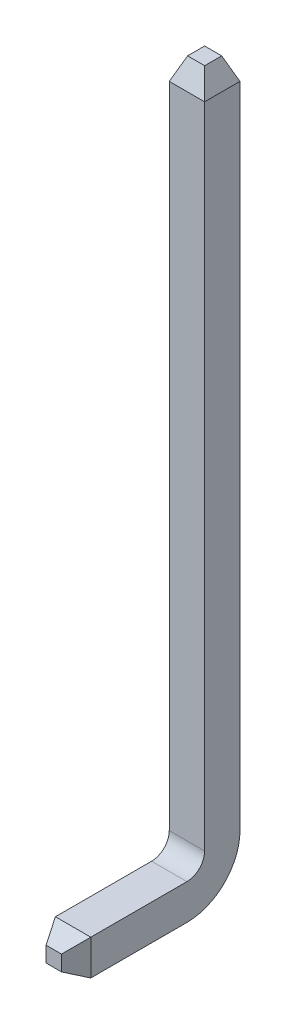
ISO-10303-21;
HEADER;
FILE_DESCRIPTION(('STEP AP214'),'2;1');
FILE_NAME('part.step','',(''),(''),'','','');
FILE_SCHEMA(('AUTOMOTIVE_DESIGN { 1 0 10303 214 1 1 1 1 }'));
ENDSEC;
DATA;
#1=APPLICATION_CONTEXT('core data for automotive mechanical design processes');
#2=APPLICATION_PROTOCOL_DEFINITION('international standard','automotive_design',2000,#1);
#3=PRODUCT_CONTEXT('',#1,'mechanical');
#4=PRODUCT('Part','Part','',(#3));
#5=PRODUCT_RELATED_PRODUCT_CATEGORY('part','',(#4));
#6=PRODUCT_DEFINITION_FORMATION('','',#4);
#7=PRODUCT_DEFINITION_CONTEXT('part definition',#1,'design');
#8=PRODUCT_DEFINITION('design','',#6,#7);
#9=PRODUCT_DEFINITION_SHAPE('','',#8);
#10=(LENGTH_UNIT() NAMED_UNIT(*) SI_UNIT(.MILLI.,.METRE.));
#11=(NAMED_UNIT(*) PLANE_ANGLE_UNIT() SI_UNIT($,.RADIAN.));
#12=(NAMED_UNIT(*) SI_UNIT($,.STERADIAN.) SOLID_ANGLE_UNIT());
#13=UNCERTAINTY_MEASURE_WITH_UNIT(LENGTH_MEASURE(1.E-05),#10,'distance_accuracy_value','');
#14=(GEOMETRIC_REPRESENTATION_CONTEXT(3) GLOBAL_UNCERTAINTY_ASSIGNED_CONTEXT((#13)) GLOBAL_UNIT_ASSIGNED_CONTEXT((#10,
#11,#12)) REPRESENTATION_CONTEXT('',''));
#15=CARTESIAN_POINT('',(0.,0.,0.));
#16=DIRECTION('',(0.,0.,1.));
#17=DIRECTION('',(1.,0.,0.));
#18=AXIS2_PLACEMENT_3D('',#15,#16,#17);
#19=CARTESIAN_POINT('',(0.164314575050762,9.85,-8.42));
#20=DIRECTION('',(0.923879532511288,0.382683432365087,0.));
#21=DIRECTION('',(-0.382683432365087,0.923879532511288,0.));
#22=AXIS2_PLACEMENT_3D('',#19,#20,#21);
#23=PLANE('',#22);
#24=DIRECTION('',(0.357406744336591,-0.862856209461019,-0.357406744336591));
#25=VECTOR('',#24,1.);
#26=CARTESIAN_POINT('',(0.164314575050762,9.85,1.10568542494924));
#27=LINE('',#26,#25);
#28=CARTESIAN_POINT('',(0.164314575050762,9.85,1.10568542494924));
#29=VERTEX_POINT('',#28);
#30=CARTESIAN_POINT('',(0.33,9.45,0.94));
#31=VERTEX_POINT('',#30);
#32=EDGE_CURVE('E110',#29,#31,#27,.T.);
#33=ORIENTED_EDGE('',*,*,#32,.F.);
#34=DIRECTION('',(0.,0.,-1.));
#35=VECTOR('',#34,1.);
#36=CARTESIAN_POINT('',(0.164314575050762,9.85,-8.42));
#37=LINE('',#36,#35);
#38=CARTESIAN_POINT('',(0.164314575050762,9.85,1.41431457505076));
#39=VERTEX_POINT('',#38);
#40=EDGE_CURVE('E105',#29,#39,#37,.F.);
#41=ORIENTED_EDGE('',*,*,#40,.T.);
#42=DIRECTION('',(-0.357406744336591,0.862856209461019,-0.357406744336591));
#43=VECTOR('',#42,1.);
#44=CARTESIAN_POINT('',(0.33,9.45,1.58));
#45=LINE('',#44,#43);
#46=CARTESIAN_POINT('',(0.33,9.45,1.58));
#47=VERTEX_POINT('',#46);
#48=EDGE_CURVE('E107',#47,#39,#45,.T.);
#49=ORIENTED_EDGE('',*,*,#48,.F.);
#50=DIRECTION('',(0.,0.,-1.));
#51=VECTOR('',#50,1.);
#52=CARTESIAN_POINT('',(0.33,9.45,3.64));
#53=LINE('',#52,#51);
#54=EDGE_CURVE('E226',#31,#47,#53,.F.);
#55=ORIENTED_EDGE('',*,*,#54,.F.);
#56=EDGE_LOOP('',(#33,#41,#49,#55));
#57=FACE_BOUND('',#56,.T.);
#58=ADVANCED_FACE('F17',(#57),#23,.T.);
#59=CARTESIAN_POINT('',(0.15,-3.25,3.99));
#60=DIRECTION('',(0.889287802318019,0.,0.45734801262101));
#61=DIRECTION('',(0.45734801262101,0.,-0.889287802318019));
#62=AXIS2_PLACEMENT_3D('',#59,#60,#61);
#63=PLANE('',#62);
#64=DIRECTION('',(-0.415914073839761,0.415914073839919,0.808721810243731));
#65=VECTOR('',#64,1.);
#66=CARTESIAN_POINT('',(0.330000000000024,-3.25000000000009,3.64000000000006));
#67=LINE('',#66,#65);
#68=CARTESIAN_POINT('',(0.330000000000005,-3.25000000000002,3.64000000000003));
#69=VERTEX_POINT('',#68);
#70=CARTESIAN_POINT('',(0.15,-3.07,3.99));
#71=VERTEX_POINT('',#70);
#72=EDGE_CURVE('E139',#69,#71,#67,.T.);
#73=ORIENTED_EDGE('',*,*,#72,.F.);
#74=DIRECTION('',(0.,1.,0.));
#75=VECTOR('',#74,1.);
#76=CARTESIAN_POINT('',(0.33,-3.4065,3.64000000000001));
#77=LINE('',#76,#75);
#78=CARTESIAN_POINT('',(0.330000000000018,-2.60999999999998,3.64000000000002));
#79=VERTEX_POINT('',#78);
#80=EDGE_CURVE('E76',#79,#69,#77,.F.);
#81=ORIENTED_EDGE('',*,*,#80,.F.);
#82=DIRECTION('',(0.415914073839761,0.415914073839919,-0.80872181024373));
#83=VECTOR('',#82,1.);
#84=CARTESIAN_POINT('',(0.15,-2.79,3.99));
#85=LINE('',#84,#83);
#86=CARTESIAN_POINT('',(0.15,-2.79,3.99));
#87=VERTEX_POINT('',#86);
#88=EDGE_CURVE('E147',#87,#79,#85,.T.);
#89=ORIENTED_EDGE('',*,*,#88,.F.);
#90=DIRECTION('',(0.,1.,0.));
#91=VECTOR('',#90,1.);
#92=CARTESIAN_POINT('',(0.15,-3.07,3.99));
#93=LINE('',#92,#91);
#94=EDGE_CURVE('E144',#71,#87,#93,.T.);
#95=ORIENTED_EDGE('',*,*,#94,.F.);
#96=EDGE_LOOP('',(#73,#81,#89,#95));
#97=FACE_BOUND('',#96,.T.);
#98=ADVANCED_FACE('F369',(#97),#63,.T.);
#99=CARTESIAN_POINT('',(-0.501658940511742,9.85,1.41431457505076));
#100=DIRECTION('',(0.,0.382683432365087,0.923879532511288));
#101=DIRECTION('',(0.,-0.923879532511288,0.382683432365087));
#102=AXIS2_PLACEMENT_3D('',#99,#100,#101);
#103=PLANE('',#102);
#104=DIRECTION('',(0.357406744336591,0.862856209461019,-0.357406744336591));
#105=VECTOR('',#104,1.);
#106=CARTESIAN_POINT('',(-0.31,9.45,1.58));
#107=LINE('',#106,#105);
#108=CARTESIAN_POINT('',(-0.31,9.45,1.58));
#109=VERTEX_POINT('',#108);
#110=CARTESIAN_POINT('',(-0.144314575050762,9.85,1.41431457505076));
#111=VERTEX_POINT('',#110);
#112=EDGE_CURVE('E189',#109,#111,#107,.T.);
#113=ORIENTED_EDGE('',*,*,#112,.F.);
#114=DIRECTION('',(1.,0.,0.));
#115=VECTOR('',#114,1.);
#116=CARTESIAN_POINT('',(-0.31,9.45,1.58));
#117=LINE('',#116,#115);
#118=EDGE_CURVE('E122',#47,#109,#117,.F.);
#119=ORIENTED_EDGE('',*,*,#118,.F.);
#120=ORIENTED_EDGE('',*,*,#48,.T.);
#121=DIRECTION('',(1.,0.,0.));
#122=VECTOR('',#121,1.);
#123=CARTESIAN_POINT('',(-0.501658940511742,9.85,1.41431457505076));
#124=LINE('',#123,#122);
#125=EDGE_CURVE('E114',#39,#111,#124,.F.);
#126=ORIENTED_EDGE('',*,*,#125,.T.);
#127=EDGE_LOOP('',(#113,#119,#120,#126));
#128=FACE_BOUND('',#127,.T.);
#129=ADVANCED_FACE('F119',(#128),#103,.T.);
#130=CARTESIAN_POINT('',(-0.501658940511742,9.85,-8.42));
#131=DIRECTION('',(0.,-1.,0.));
#132=DIRECTION('',(0.,0.,-1.));
#133=AXIS2_PLACEMENT_3D('',#130,#131,#132);
#134=PLANE('',#133);
#135=DIRECTION('',(0.,0.,1.));
#136=VECTOR('',#135,1.);
#137=CARTESIAN_POINT('',(-0.144314575050762,9.85,-8.42));
#138=LINE('',#137,#136);
#139=CARTESIAN_POINT('',(-0.144314575050762,9.85,1.10568542494924));
#140=VERTEX_POINT('',#139);
#141=EDGE_CURVE('E127',#111,#140,#138,.F.);
#142=ORIENTED_EDGE('',*,*,#141,.F.);
#143=ORIENTED_EDGE('',*,*,#125,.F.);
#144=ORIENTED_EDGE('',*,*,#40,.F.);
#145=DIRECTION('',(1.,0.,0.));
#146=VECTOR('',#145,1.);
#147=CARTESIAN_POINT('',(-0.501658940511742,9.85,1.10568542494924));
#148=LINE('',#147,#146);
#149=EDGE_CURVE('E130',#140,#29,#148,.T.);
#150=ORIENTED_EDGE('',*,*,#149,.F.);
#151=EDGE_LOOP('',(#142,#143,#144,#150));
#152=FACE_BOUND('',#151,.T.);
#153=ADVANCED_FACE('F125',(#152),#134,.F.);
#154=CARTESIAN_POINT('',(-0.501658940511742,9.85,1.10568542494924));
#155=DIRECTION('',(0.,0.382683432365087,-0.923879532511288));
#156=DIRECTION('',(0.,0.923879532511288,0.382683432365087));
#157=AXIS2_PLACEMENT_3D('',#154,#155,#156);
#158=PLANE('',#157);
#159=DIRECTION('',(-0.357406744336591,-0.862856209461019,-0.357406744336591));
#160=VECTOR('',#159,1.);
#161=CARTESIAN_POINT('',(-0.144314575050762,9.85,1.10568542494924));
#162=LINE('',#161,#160);
#163=CARTESIAN_POINT('',(-0.31,9.45,0.94));
#164=VERTEX_POINT('',#163);
#165=EDGE_CURVE('E186',#140,#164,#162,.T.);
#166=ORIENTED_EDGE('',*,*,#165,.F.);
#167=ORIENTED_EDGE('',*,*,#149,.T.);
#168=ORIENTED_EDGE('',*,*,#32,.T.);
#169=DIRECTION('',(-1.,0.,0.));
#170=VECTOR('',#169,1.);
#171=CARTESIAN_POINT('',(0.33,9.45,0.94));
#172=LINE('',#171,#170);
#173=EDGE_CURVE('E170',#164,#31,#172,.F.);
#174=ORIENTED_EDGE('',*,*,#173,.F.);
#175=EDGE_LOOP('',(#166,#167,#168,#174));
#176=FACE_BOUND('',#175,.T.);
#177=ADVANCED_FACE('F259',(#176),#158,.T.);
#178=CARTESIAN_POINT('',(-0.31,-3.07,3.99));
#179=DIRECTION('',(0.,-0.889287802318019,0.45734801262101));
#180=DIRECTION('',(0.,-0.45734801262101,-0.889287802318019));
#181=AXIS2_PLACEMENT_3D('',#178,#179,#180);
#182=PLANE('',#181);
#183=DIRECTION('',(0.415914073839919,0.415914073839762,0.80872181024373));
#184=VECTOR('',#183,1.);
#185=CARTESIAN_POINT('',(-0.310000000000093,-3.25000000000002,3.64000000000006));
#186=LINE('',#185,#184);
#187=CARTESIAN_POINT('',(-0.310000000000022,-3.25000000000001,3.64000000000003));
#188=VERTEX_POINT('',#187);
#189=CARTESIAN_POINT('',(-0.13,-3.07,3.99));
#190=VERTEX_POINT('',#189);
#191=EDGE_CURVE('E217',#188,#190,#186,.T.);
#192=ORIENTED_EDGE('',*,*,#191,.F.);
#193=DIRECTION('',(1.,0.,0.));
#194=VECTOR('',#193,1.);
#195=CARTESIAN_POINT('',(-0.31,-3.25,3.64000000000001));
#196=LINE('',#195,#194);
#197=EDGE_CURVE('E234',#69,#188,#196,.F.);
#198=ORIENTED_EDGE('',*,*,#197,.F.);
#199=ORIENTED_EDGE('',*,*,#72,.T.);
#200=DIRECTION('',(1.,0.,0.));
#201=VECTOR('',#200,1.);
#202=CARTESIAN_POINT('',(-0.13,-3.07,3.99));
#203=LINE('',#202,#201);
#204=EDGE_CURVE('E148',#190,#71,#203,.T.);
#205=ORIENTED_EDGE('',*,*,#204,.F.);
#206=EDGE_LOOP('',(#192,#198,#199,#205));
#207=FACE_BOUND('',#206,.T.);
#208=ADVANCED_FACE('F360',(#207),#182,.T.);
#209=CARTESIAN_POINT('',(-0.13,-3.07,3.99));
#210=DIRECTION('',(0.,0.,1.));
#211=DIRECTION('',(1.,0.,0.));
#212=AXIS2_PLACEMENT_3D('',#209,#210,#211);
#213=PLANE('',#212);
#214=ORIENTED_EDGE('',*,*,#204,.T.);
#215=ORIENTED_EDGE('',*,*,#94,.T.);
#216=DIRECTION('',(1.,0.,0.));
#217=VECTOR('',#216,1.);
#218=CARTESIAN_POINT('',(0.33,-2.79,3.99));
#219=LINE('',#218,#217);
#220=CARTESIAN_POINT('',(-0.13,-2.79,3.99));
#221=VERTEX_POINT('',#220);
#222=EDGE_CURVE('E211',#221,#87,#219,.T.);
#223=ORIENTED_EDGE('',*,*,#222,.F.);
#224=DIRECTION('',(0.,1.,0.));
#225=VECTOR('',#224,1.);
#226=CARTESIAN_POINT('',(-0.13,-2.61,3.99));
#227=LINE('',#226,#225);
#228=EDGE_CURVE('E214',#190,#221,#227,.T.);
#229=ORIENTED_EDGE('',*,*,#228,.F.);
#230=EDGE_LOOP('',(#214,#215,#223,#229));
#231=FACE_BOUND('',#230,.T.);
#232=ADVANCED_FACE('F357',(#231),#213,.T.);
#233=CARTESIAN_POINT('',(0.33,-2.79,3.99));
#234=DIRECTION('',(0.,0.889287802318019,0.45734801262101));
#235=DIRECTION('',(0.,-0.45734801262101,0.889287802318019));
#236=AXIS2_PLACEMENT_3D('',#233,#234,#235);
#237=PLANE('',#236);
#238=DIRECTION('',(-0.415914073839919,0.415914073839761,-0.808721810243731));
#239=VECTOR('',#238,1.);
#240=CARTESIAN_POINT('',(-0.13,-2.79,3.99));
#241=LINE('',#240,#239);
#242=CARTESIAN_POINT('',(-0.310000000000023,-2.60999999999998,3.64000000000002));
#243=VERTEX_POINT('',#242);
#244=EDGE_CURVE('E285',#221,#243,#241,.T.);
#245=ORIENTED_EDGE('',*,*,#244,.F.);
#246=ORIENTED_EDGE('',*,*,#222,.T.);
#247=ORIENTED_EDGE('',*,*,#88,.T.);
#248=DIRECTION('',(1.,0.,0.));
#249=VECTOR('',#248,1.);
#250=CARTESIAN_POINT('',(0.33,-2.61,3.64000000000001));
#251=LINE('',#250,#249);
#252=EDGE_CURVE('E204',#243,#79,#251,.T.);
#253=ORIENTED_EDGE('',*,*,#252,.F.);
#254=EDGE_LOOP('',(#245,#246,#247,#253));
#255=FACE_BOUND('',#254,.T.);
#256=ADVANCED_FACE('F314',(#255),#237,.T.);
#257=CARTESIAN_POINT('',(0.33,-3.4065,3.64));
#258=DIRECTION('',(1.,0.,0.));
#259=DIRECTION('',(0.,0.,-1.));
#260=AXIS2_PLACEMENT_3D('',#257,#258,#259);
#261=PLANE('',#260);
#262=DIRECTION('',(0.,0.,-1.));
#263=VECTOR('',#262,1.);
#264=CARTESIAN_POINT('',(0.33,-3.25,1.9));
#265=LINE('',#264,#263);
#266=CARTESIAN_POINT('',(0.33,-3.25,1.9));
#267=VERTEX_POINT('',#266);
#268=EDGE_CURVE('E165',#267,#69,#265,.F.);
#269=ORIENTED_EDGE('',*,*,#268,.F.);
#270=CARTESIAN_POINT('',(0.33,-2.29,1.9));
#271=DIRECTION('',(1.,0.,0.));
#272=DIRECTION('',(0.,0.,-1.));
#273=AXIS2_PLACEMENT_3D('',#270,#271,#272);
#274=CIRCLE('',#273,0.96);
#275=CARTESIAN_POINT('',(0.33,-2.29,0.94));
#276=VERTEX_POINT('',#275);
#277=EDGE_CURVE('E157',#276,#267,#274,.F.);
#278=ORIENTED_EDGE('',*,*,#277,.F.);
#279=DIRECTION('',(0.,1.,0.));
#280=VECTOR('',#279,1.);
#281=CARTESIAN_POINT('',(0.33,-2.29,0.94));
#282=LINE('',#281,#280);
#283=EDGE_CURVE('E167',#31,#276,#282,.F.);
#284=ORIENTED_EDGE('',*,*,#283,.F.);
#285=ORIENTED_EDGE('',*,*,#54,.T.);
#286=DIRECTION('',(0.,1.,0.));
#287=VECTOR('',#286,1.);
#288=CARTESIAN_POINT('',(0.33,-2.29,1.58));
#289=LINE('',#288,#287);
#290=CARTESIAN_POINT('',(0.33,-2.29,1.58));
#291=VERTEX_POINT('',#290);
#292=EDGE_CURVE('E196',#291,#47,#289,.T.);
#293=ORIENTED_EDGE('',*,*,#292,.F.);
#294=CARTESIAN_POINT('',(0.33,-2.29,1.9));
#295=DIRECTION('',(-1.,0.,0.));
#296=DIRECTION('',(0.,0.,1.));
#297=AXIS2_PLACEMENT_3D('',#294,#295,#296);
#298=CIRCLE('',#297,0.32);
#299=CARTESIAN_POINT('',(0.330000000000012,-2.61,1.9));
#300=VERTEX_POINT('',#299);
#301=EDGE_CURVE('E20',#291,#300,#298,.T.);
#302=ORIENTED_EDGE('',*,*,#301,.T.);
#303=DIRECTION('',(0.,0.,1.));
#304=VECTOR('',#303,1.);
#305=CARTESIAN_POINT('',(0.330000000000024,-2.61,1.9));
#306=LINE('',#305,#304);
#307=EDGE_CURVE('E202',#79,#300,#306,.F.);
#308=ORIENTED_EDGE('',*,*,#307,.F.);
#309=ORIENTED_EDGE('',*,*,#80,.T.);
#310=EDGE_LOOP('',(#269,#278,#284,#285,#293,#302,#308,#309));
#311=FACE_BOUND('',#310,.T.);
#312=ADVANCED_FACE('F254',(#311),#261,.T.);
#313=CARTESIAN_POINT('',(-0.31,-2.29,1.58));
#314=DIRECTION('',(0.,0.,1.));
#315=DIRECTION('',(1.,0.,0.));
#316=AXIS2_PLACEMENT_3D('',#313,#314,#315);
#317=PLANE('',#316);
#318=DIRECTION('',(0.,1.,0.));
#319=VECTOR('',#318,1.);
#320=CARTESIAN_POINT('',(-0.31,-3.4065,1.58));
#321=LINE('',#320,#319);
#322=CARTESIAN_POINT('',(-0.31,-2.29,1.58));
#323=VERTEX_POINT('',#322);
#324=EDGE_CURVE('E183',#323,#109,#321,.T.);
#325=ORIENTED_EDGE('',*,*,#324,.F.);
#326=DIRECTION('',(-1.,0.,0.));
#327=VECTOR('',#326,1.);
#328=CARTESIAN_POINT('',(0.33,-2.29,1.58));
#329=LINE('',#328,#327);
#330=EDGE_CURVE('E252',#323,#291,#329,.F.);
#331=ORIENTED_EDGE('',*,*,#330,.T.);
#332=ORIENTED_EDGE('',*,*,#292,.T.);
#333=ORIENTED_EDGE('',*,*,#118,.T.);
#334=EDGE_LOOP('',(#325,#331,#332,#333));
#335=FACE_BOUND('',#334,.T.);
#336=ADVANCED_FACE('F250',(#335),#317,.T.);
#337=CARTESIAN_POINT('',(-0.144314575050762,9.85,-8.42));
#338=DIRECTION('',(-0.923879532511288,0.382683432365087,0.));
#339=DIRECTION('',(-0.382683432365087,-0.923879532511288,0.));
#340=AXIS2_PLACEMENT_3D('',#337,#338,#339);
#341=PLANE('',#340);
#342=ORIENTED_EDGE('',*,*,#112,.T.);
#343=ORIENTED_EDGE('',*,*,#141,.T.);
#344=ORIENTED_EDGE('',*,*,#165,.T.);
#345=DIRECTION('',(0.,0.,1.));
#346=VECTOR('',#345,1.);
#347=CARTESIAN_POINT('',(-0.31,9.45,0.913));
#348=LINE('',#347,#346);
#349=EDGE_CURVE('E180',#109,#164,#348,.F.);
#350=ORIENTED_EDGE('',*,*,#349,.F.);
#351=EDGE_LOOP('',(#342,#343,#344,#350));
#352=FACE_BOUND('',#351,.T.);
#353=ADVANCED_FACE('F244',(#352),#341,.T.);
#354=CARTESIAN_POINT('',(0.33,-2.29,0.94));
#355=DIRECTION('',(0.,0.,-1.));
#356=DIRECTION('',(-1.,0.,0.));
#357=AXIS2_PLACEMENT_3D('',#354,#355,#356);
#358=PLANE('',#357);
#359=ORIENTED_EDGE('',*,*,#283,.T.);
#360=DIRECTION('',(1.,0.,0.));
#361=VECTOR('',#360,1.);
#362=CARTESIAN_POINT('',(-0.31,-2.29,0.94));
#363=LINE('',#362,#361);
#364=CARTESIAN_POINT('',(-0.31,-2.29,0.94));
#365=VERTEX_POINT('',#364);
#366=EDGE_CURVE('E159',#365,#276,#363,.T.);
#367=ORIENTED_EDGE('',*,*,#366,.F.);
#368=DIRECTION('',(0.,1.,0.));
#369=VECTOR('',#368,1.);
#370=CARTESIAN_POINT('',(-0.31,-3.4065,0.94));
#371=LINE('',#370,#369);
#372=EDGE_CURVE('E156',#164,#365,#371,.F.);
#373=ORIENTED_EDGE('',*,*,#372,.F.);
#374=ORIENTED_EDGE('',*,*,#173,.T.);
#375=EDGE_LOOP('',(#359,#367,#373,#374));
#376=FACE_BOUND('',#375,.T.);
#377=ADVANCED_FACE('F262',(#376),#358,.T.);
#378=CARTESIAN_POINT('',(-0.31,-2.29,1.9));
#379=DIRECTION('',(1.,0.,0.));
#380=DIRECTION('',(0.,0.,-1.));
#381=AXIS2_PLACEMENT_3D('',#378,#379,#380);
#382=CYLINDRICAL_SURFACE('',#381,0.96);
#383=ORIENTED_EDGE('',*,*,#366,.T.);
#384=ORIENTED_EDGE('',*,*,#277,.T.);
#385=DIRECTION('',(1.,0.,0.));
#386=VECTOR('',#385,1.);
#387=CARTESIAN_POINT('',(-0.31,-3.25,1.9));
#388=LINE('',#387,#386);
#389=CARTESIAN_POINT('',(-0.31,-3.25,1.9));
#390=VERTEX_POINT('',#389);
#391=EDGE_CURVE('E158',#390,#267,#388,.T.);
#392=ORIENTED_EDGE('',*,*,#391,.F.);
#393=CARTESIAN_POINT('',(-0.31,-2.29,1.9));
#394=DIRECTION('',(1.,0.,0.));
#395=DIRECTION('',(0.,0.,-1.));
#396=AXIS2_PLACEMENT_3D('',#393,#394,#395);
#397=CIRCLE('',#396,0.96);
#398=EDGE_CURVE('E153',#365,#390,#397,.F.);
#399=ORIENTED_EDGE('',*,*,#398,.F.);
#400=EDGE_LOOP('',(#383,#384,#392,#399));
#401=FACE_BOUND('',#400,.T.);
#402=ADVANCED_FACE('F317',(#401),#382,.T.);
#403=CARTESIAN_POINT('',(-0.31,-3.25,1.9));
#404=DIRECTION('',(0.,-1.,0.));
#405=DIRECTION('',(0.,0.,-1.));
#406=AXIS2_PLACEMENT_3D('',#403,#404,#405);
#407=PLANE('',#406);
#408=ORIENTED_EDGE('',*,*,#197,.T.);
#409=DIRECTION('',(0.,0.,1.));
#410=VECTOR('',#409,1.);
#411=CARTESIAN_POINT('',(-0.31,-3.25,0.913));
#412=LINE('',#411,#410);
#413=EDGE_CURVE('E155',#390,#188,#412,.T.);
#414=ORIENTED_EDGE('',*,*,#413,.F.);
#415=ORIENTED_EDGE('',*,*,#391,.T.);
#416=ORIENTED_EDGE('',*,*,#268,.T.);
#417=EDGE_LOOP('',(#408,#414,#415,#416));
#418=FACE_BOUND('',#417,.T.);
#419=ADVANCED_FACE('F298',(#418),#407,.T.);
#420=CARTESIAN_POINT('',(-0.13,-2.61,3.99));
#421=DIRECTION('',(-0.889287802318019,0.,0.45734801262101));
#422=DIRECTION('',(0.45734801262101,0.,0.889287802318019));
#423=AXIS2_PLACEMENT_3D('',#420,#421,#422);
#424=PLANE('',#423);
#425=ORIENTED_EDGE('',*,*,#191,.T.);
#426=ORIENTED_EDGE('',*,*,#228,.T.);
#427=ORIENTED_EDGE('',*,*,#244,.T.);
#428=DIRECTION('',(0.,1.,0.));
#429=VECTOR('',#428,1.);
#430=CARTESIAN_POINT('',(-0.31,-3.4065,3.64000000000001));
#431=LINE('',#430,#429);
#432=EDGE_CURVE('E280',#188,#243,#431,.T.);
#433=ORIENTED_EDGE('',*,*,#432,.F.);
#434=EDGE_LOOP('',(#425,#426,#427,#433));
#435=FACE_BOUND('',#434,.T.);
#436=ADVANCED_FACE('F304',(#435),#424,.T.);
#437=CARTESIAN_POINT('',(0.33,-2.61,1.9));
#438=DIRECTION('',(0.,1.,0.));
#439=DIRECTION('',(0.,0.,1.));
#440=AXIS2_PLACEMENT_3D('',#437,#438,#439);
#441=PLANE('',#440);
#442=ORIENTED_EDGE('',*,*,#307,.T.);
#443=DIRECTION('',(-1.,0.,0.));
#444=VECTOR('',#443,1.);
#445=CARTESIAN_POINT('',(0.33,-2.61,1.9));
#446=LINE('',#445,#444);
#447=CARTESIAN_POINT('',(-0.31,-2.60999999999999,1.9));
#448=VERTEX_POINT('',#447);
#449=EDGE_CURVE('E35',#300,#448,#446,.T.);
#450=ORIENTED_EDGE('',*,*,#449,.T.);
#451=DIRECTION('',(0.,0.,1.));
#452=VECTOR('',#451,1.);
#453=CARTESIAN_POINT('',(-0.31,-2.60999999999998,0.913));
#454=LINE('',#453,#452);
#455=EDGE_CURVE('E26',#243,#448,#454,.F.);
#456=ORIENTED_EDGE('',*,*,#455,.F.);
#457=ORIENTED_EDGE('',*,*,#252,.T.);
#458=EDGE_LOOP('',(#442,#450,#456,#457));
#459=FACE_BOUND('',#458,.T.);
#460=ADVANCED_FACE('F312',(#459),#441,.T.);
#461=CARTESIAN_POINT('',(0.33,-2.29,1.9));
#462=DIRECTION('',(-1.,0.,0.));
#463=DIRECTION('',(0.,0.,1.));
#464=AXIS2_PLACEMENT_3D('',#461,#462,#463);
#465=CYLINDRICAL_SURFACE('',#464,0.32);
#466=CARTESIAN_POINT('',(-0.31,-2.29,1.9));
#467=DIRECTION('',(-1.,0.,0.));
#468=DIRECTION('',(0.,0.,1.));
#469=AXIS2_PLACEMENT_3D('',#466,#467,#468);
#470=CIRCLE('',#469,0.32);
#471=EDGE_CURVE('E11',#448,#323,#470,.F.);
#472=ORIENTED_EDGE('',*,*,#471,.F.);
#473=ORIENTED_EDGE('',*,*,#449,.F.);
#474=ORIENTED_EDGE('',*,*,#301,.F.);
#475=ORIENTED_EDGE('',*,*,#330,.F.);
#476=EDGE_LOOP('',(#472,#473,#474,#475));
#477=FACE_BOUND('',#476,.T.);
#478=ADVANCED_FACE('F328',(#477),#465,.F.);
#479=CARTESIAN_POINT('',(-0.31,-3.4065,0.913));
#480=DIRECTION('',(-1.,0.,0.));
#481=DIRECTION('',(0.,0.,1.));
#482=AXIS2_PLACEMENT_3D('',#479,#480,#481);
#483=PLANE('',#482);
#484=ORIENTED_EDGE('',*,*,#455,.T.);
#485=ORIENTED_EDGE('',*,*,#471,.T.);
#486=ORIENTED_EDGE('',*,*,#324,.T.);
#487=ORIENTED_EDGE('',*,*,#349,.T.);
#488=ORIENTED_EDGE('',*,*,#372,.T.);
#489=ORIENTED_EDGE('',*,*,#398,.T.);
#490=ORIENTED_EDGE('',*,*,#413,.T.);
#491=ORIENTED_EDGE('',*,*,#432,.T.);
#492=EDGE_LOOP('',(#484,#485,#486,#487,#488,#489,#490,#491));
#493=FACE_BOUND('',#492,.T.);
#494=ADVANCED_FACE('F267',(#493),#483,.T.);
#495=CLOSED_SHELL('',(#58,#98,#129,#153,#177,#208,#232,#256,#312,#336,#353,#377,#402,#419,#436,
#460,#478,#494));
#496=MANIFOLD_SOLID_BREP('B1',#495);
#497=ADVANCED_BREP_SHAPE_REPRESENTATION('',(#18,#496),#14);
#498=SHAPE_DEFINITION_REPRESENTATION(#9,#497);
ENDSEC;
END-ISO-10303-21;
